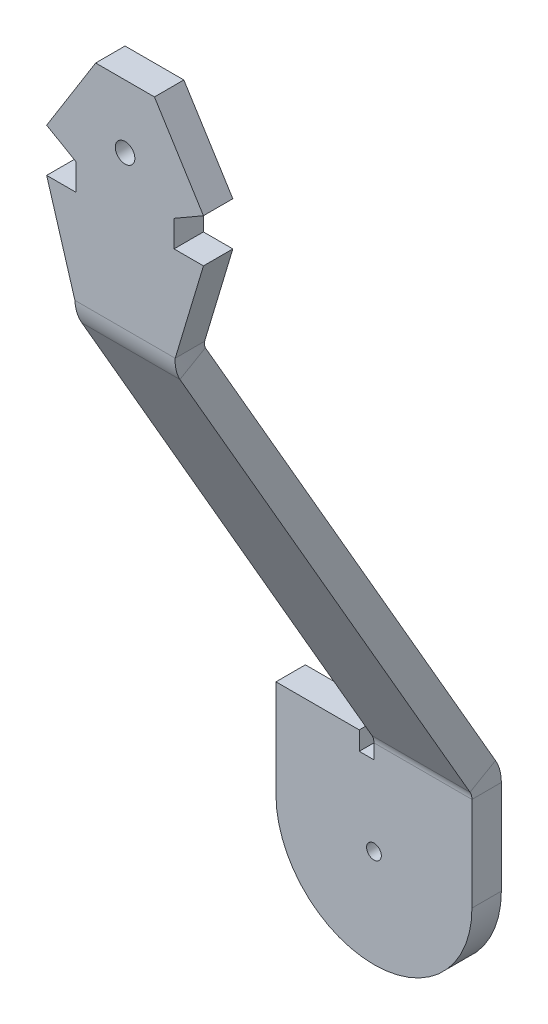
ISO-10303-21;
HEADER;
FILE_DESCRIPTION(('STEP AP214'),'2;1');
FILE_NAME('part.step','',(''),(''),'','','');
FILE_SCHEMA(('AUTOMOTIVE_DESIGN { 1 0 10303 214 1 1 1 1 }'));
ENDSEC;
DATA;
#1=APPLICATION_CONTEXT('core data for automotive mechanical design processes');
#2=APPLICATION_PROTOCOL_DEFINITION('international standard','automotive_design',2000,#1);
#3=PRODUCT_CONTEXT('',#1,'mechanical');
#4=PRODUCT('Part','Part','',(#3));
#5=PRODUCT_RELATED_PRODUCT_CATEGORY('part','',(#4));
#6=PRODUCT_DEFINITION_FORMATION('','',#4);
#7=PRODUCT_DEFINITION_CONTEXT('part definition',#1,'design');
#8=PRODUCT_DEFINITION('design','',#6,#7);
#9=PRODUCT_DEFINITION_SHAPE('','',#8);
#10=(LENGTH_UNIT() NAMED_UNIT(*) SI_UNIT(.MILLI.,.METRE.));
#11=(NAMED_UNIT(*) PLANE_ANGLE_UNIT() SI_UNIT($,.RADIAN.));
#12=(NAMED_UNIT(*) SI_UNIT($,.STERADIAN.) SOLID_ANGLE_UNIT());
#13=UNCERTAINTY_MEASURE_WITH_UNIT(LENGTH_MEASURE(1.E-05),#10,'distance_accuracy_value','');
#14=(GEOMETRIC_REPRESENTATION_CONTEXT(3) GLOBAL_UNCERTAINTY_ASSIGNED_CONTEXT((#13)) GLOBAL_UNIT_ASSIGNED_CONTEXT((#10,
#11,#12)) REPRESENTATION_CONTEXT('',''));
#15=CARTESIAN_POINT('',(0.,0.,0.));
#16=DIRECTION('',(0.,0.,1.));
#17=DIRECTION('',(1.,0.,0.));
#18=AXIS2_PLACEMENT_3D('',#15,#16,#17);
#19=CARTESIAN_POINT('',(0.,31.7307621135332,13.7009618943232));
#20=DIRECTION('',(1.,0.,0.));
#21=DIRECTION('',(0.,1.,0.));
#22=AXIS2_PLACEMENT_3D('',#19,#20,#21);
#23=PLANE('',#22);
#24=DIRECTION('',(0.,-0.499999999999993,0.866025403784442));
#25=VECTOR('',#24,1.);
#26=CARTESIAN_POINT('',(0.,31.559833488678,13.6022762067508));
#27=LINE('',#26,#25);
#28=CARTESIAN_POINT('',(0.,31.559833488678,13.6022762067508));
#29=VERTEX_POINT('',#28);
#30=CARTESIAN_POINT('',(0.,30.809833488678,14.9013143124275));
#31=VERTEX_POINT('',#30);
#32=EDGE_CURVE('E321',#29,#31,#27,.T.);
#33=ORIENTED_EDGE('',*,*,#32,.F.);
#34=DIRECTION('',(0.,0.866025403784442,0.499999999999995));
#35=VECTOR('',#34,1.);
#36=CARTESIAN_POINT('',(0.,31.7307621135332,13.7009618943232));
#37=LINE('',#36,#35);
#38=CARTESIAN_POINT('',(0.,5.92092862485523,-1.20035241810428));
#39=VERTEX_POINT('',#38);
#40=EDGE_CURVE('E547',#39,#29,#37,.T.);
#41=ORIENTED_EDGE('',*,*,#40,.F.);
#42=DIRECTION('',(0.,0.499999999999995,-0.866025403784441));
#43=VECTOR('',#42,1.);
#44=CARTESIAN_POINT('',(0.,5.17092862485523,0.0986856875723804));
#45=LINE('',#44,#43);
#46=CARTESIAN_POINT('',(0.,5.17092862485523,0.0986856875723799));
#47=VERTEX_POINT('',#46);
#48=EDGE_CURVE('E557',#47,#39,#45,.T.);
#49=ORIENTED_EDGE('',*,*,#48,.F.);
#50=DIRECTION('',(0.,0.866025403784442,0.499999999999995));
#51=VECTOR('',#50,1.);
#52=CARTESIAN_POINT('',(0.,30.9807621135332,14.9999999999998));
#53=LINE('',#52,#51);
#54=EDGE_CURVE('E548',#47,#31,#53,.T.);
#55=ORIENTED_EDGE('',*,*,#54,.T.);
#56=EDGE_LOOP('',(#33,#41,#49,#55));
#57=FACE_BOUND('',#56,.T.);
#58=ADVANCED_FACE('F39',(#57),#23,.F.);
#59=CARTESIAN_POINT('',(5.,5.74999999999999,-1.29903810567666));
#60=DIRECTION('',(-1.,0.,0.));
#61=DIRECTION('',(0.,0.,1.));
#62=AXIS2_PLACEMENT_3D('',#59,#60,#61);
#63=PLANE('',#62);
#64=DIRECTION('',(0.,-0.499999999999993,0.866025403784442));
#65=VECTOR('',#64,1.);
#66=CARTESIAN_POINT('',(5.,31.559833488678,13.6022762067508));
#67=LINE('',#66,#65);
#68=CARTESIAN_POINT('',(5.,31.559833488678,13.6022762067508));
#69=VERTEX_POINT('',#68);
#70=CARTESIAN_POINT('',(5.,30.809833488678,14.9013143124275));
#71=VERTEX_POINT('',#70);
#72=EDGE_CURVE('E324',#69,#71,#67,.T.);
#73=ORIENTED_EDGE('',*,*,#72,.T.);
#74=DIRECTION('',(0.,-0.866025403784442,-0.499999999999995));
#75=VECTOR('',#74,1.);
#76=CARTESIAN_POINT('',(5.,5.,0.));
#77=LINE('',#76,#75);
#78=CARTESIAN_POINT('',(5.,5.17092862485523,0.0986856875723803));
#79=VERTEX_POINT('',#78);
#80=EDGE_CURVE('E545',#71,#79,#77,.T.);
#81=ORIENTED_EDGE('',*,*,#80,.T.);
#82=DIRECTION('',(0.,0.499999999999995,-0.866025403784441));
#83=VECTOR('',#82,1.);
#84=CARTESIAN_POINT('',(5.,5.17092862485523,0.0986856875723804));
#85=LINE('',#84,#83);
#86=CARTESIAN_POINT('',(5.,5.92092862485523,-1.20035241810428));
#87=VERTEX_POINT('',#86);
#88=EDGE_CURVE('E323',#79,#87,#85,.T.);
#89=ORIENTED_EDGE('',*,*,#88,.T.);
#90=DIRECTION('',(0.,-0.866025403784442,-0.499999999999995));
#91=VECTOR('',#90,1.);
#92=CARTESIAN_POINT('',(5.,5.74999999999999,-1.29903810567666));
#93=LINE('',#92,#91);
#94=EDGE_CURVE('E480',#69,#87,#93,.T.);
#95=ORIENTED_EDGE('',*,*,#94,.F.);
#96=EDGE_LOOP('',(#73,#81,#89,#95));
#97=FACE_BOUND('',#96,.T.);
#98=ADVANCED_FACE('F377',(#97),#63,.F.);
#99=CARTESIAN_POINT('',(0.,1.99999999999997,-3.46410161513775));
#100=DIRECTION('',(0.,-0.499999999999995,0.866025403784442));
#101=DIRECTION('',(0.,-0.866025403784442,-0.499999999999995));
#102=AXIS2_PLACEMENT_3D('',#99,#100,#101);
#103=PLANE('',#102);
#104=DIRECTION('',(1.,0.,0.));
#105=VECTOR('',#104,1.);
#106=CARTESIAN_POINT('',(5.05921141254343,31.559833488678,13.6022762067508));
#107=LINE('',#106,#105);
#108=EDGE_CURVE('E318',#69,#29,#107,.F.);
#109=ORIENTED_EDGE('',*,*,#108,.F.);
#110=ORIENTED_EDGE('',*,*,#94,.T.);
#111=DIRECTION('',(1.,0.,0.));
#112=VECTOR('',#111,1.);
#113=CARTESIAN_POINT('',(0.,5.92092862485523,-1.20035241810428));
#114=LINE('',#113,#112);
#115=EDGE_CURVE('E551',#39,#87,#114,.T.);
#116=ORIENTED_EDGE('',*,*,#115,.F.);
#117=ORIENTED_EDGE('',*,*,#40,.T.);
#118=EDGE_LOOP('',(#109,#110,#116,#117));
#119=FACE_BOUND('',#118,.T.);
#120=ADVANCED_FACE('F367',(#119),#103,.F.);
#121=CARTESIAN_POINT('',(0.,1.24999999999998,-2.16506350946108));
#122=DIRECTION('',(0.,-0.499999999999995,0.866025403784442));
#123=DIRECTION('',(0.,-0.866025403784442,-0.499999999999995));
#124=AXIS2_PLACEMENT_3D('',#121,#122,#123);
#125=PLANE('',#124);
#126=ORIENTED_EDGE('',*,*,#80,.F.);
#127=DIRECTION('',(1.,0.,0.));
#128=VECTOR('',#127,1.);
#129=CARTESIAN_POINT('',(5.05921141254343,30.809833488678,14.9013143124275));
#130=LINE('',#129,#128);
#131=EDGE_CURVE('E210',#71,#31,#130,.F.);
#132=ORIENTED_EDGE('',*,*,#131,.T.);
#133=ORIENTED_EDGE('',*,*,#54,.F.);
#134=DIRECTION('',(-1.,0.,0.));
#135=VECTOR('',#134,1.);
#136=CARTESIAN_POINT('',(5.,5.17092862485523,0.0986856875723804));
#137=LINE('',#136,#135);
#138=EDGE_CURVE('E360',#79,#47,#137,.T.);
#139=ORIENTED_EDGE('',*,*,#138,.F.);
#140=EDGE_LOOP('',(#126,#132,#133,#139));
#141=FACE_BOUND('',#140,.T.);
#142=ADVANCED_FACE('F376',(#141),#125,.T.);
#143=CARTESIAN_POINT('',(-5.,5.,-1.5));
#144=DIRECTION('',(0.,1.,0.));
#145=DIRECTION('',(0.,0.,1.));
#146=AXIS2_PLACEMENT_3D('',#143,#144,#145);
#147=PLANE('',#146);
#148=DIRECTION('',(-1.,0.,0.));
#149=VECTOR('',#148,1.);
#150=CARTESIAN_POINT('',(-5.,5.,0.));
#151=LINE('',#150,#149);
#152=CARTESIAN_POINT('',(-0.749999999999998,5.,0.));
#153=VERTEX_POINT('',#152);
#154=CARTESIAN_POINT('',(-5.,5.,0.));
#155=VERTEX_POINT('',#154);
#156=EDGE_CURVE('E462',#153,#155,#151,.T.);
#157=ORIENTED_EDGE('',*,*,#156,.F.);
#158=DIRECTION('',(0.,0.,-1.));
#159=VECTOR('',#158,1.);
#160=CARTESIAN_POINT('',(-0.749999999999998,5.,0.));
#161=LINE('',#160,#159);
#162=CARTESIAN_POINT('',(-0.749999999999998,5.00000000000001,-1.5));
#163=VERTEX_POINT('',#162);
#164=EDGE_CURVE('E488',#153,#163,#161,.T.);
#165=ORIENTED_EDGE('',*,*,#164,.T.);
#166=DIRECTION('',(-1.,0.,0.));
#167=VECTOR('',#166,1.);
#168=CARTESIAN_POINT('',(0.,5.,-1.5));
#169=LINE('',#168,#167);
#170=CARTESIAN_POINT('',(-5.,5.,-1.5));
#171=VERTEX_POINT('',#170);
#172=EDGE_CURVE('E520',#163,#171,#169,.T.);
#173=ORIENTED_EDGE('',*,*,#172,.T.);
#174=DIRECTION('',(0.,0.,1.));
#175=VECTOR('',#174,1.);
#176=CARTESIAN_POINT('',(-5.,5.,-1.5));
#177=LINE('',#176,#175);
#178=EDGE_CURVE('E48',#171,#155,#177,.T.);
#179=ORIENTED_EDGE('',*,*,#178,.T.);
#180=EDGE_LOOP('',(#157,#165,#173,#179));
#181=FACE_BOUND('',#180,.T.);
#182=ADVANCED_FACE('F381',(#181),#147,.T.);
#183=CARTESIAN_POINT('',(0.,0.,-1.5));
#184=DIRECTION('',(0.,0.,1.));
#185=DIRECTION('',(1.,0.,0.));
#186=AXIS2_PLACEMENT_3D('',#183,#184,#185);
#187=PLANE('',#186);
#188=CARTESIAN_POINT('',(0.,0.,-1.5));
#189=DIRECTION('',(0.,0.,1.));
#190=DIRECTION('',(1.,0.,0.));
#191=AXIS2_PLACEMENT_3D('',#188,#189,#190);
#192=CIRCLE('',#191,0.375);
#193=CARTESIAN_POINT('',(0.375,0.,-1.5));
#194=VERTEX_POINT('',#193);
#195=EDGE_CURVE('E510',#194,#194,#192,.T.);
#196=ORIENTED_EDGE('',*,*,#195,.T.);
#197=EDGE_LOOP('',(#196));
#198=FACE_BOUND('',#197,.T.);
#199=DIRECTION('',(0.,1.,0.));
#200=VECTOR('',#199,1.);
#201=CARTESIAN_POINT('',(-0.749999999999999,0.,-1.5));
#202=LINE('',#201,#200);
#203=CARTESIAN_POINT('',(-0.749999999999998,4.05262862485525,-1.5));
#204=VERTEX_POINT('',#203);
#205=EDGE_CURVE('E506',#204,#163,#202,.T.);
#206=ORIENTED_EDGE('',*,*,#205,.F.);
#207=DIRECTION('',(-1.,0.,0.));
#208=VECTOR('',#207,1.);
#209=CARTESIAN_POINT('',(0.,4.05262862485525,-1.5));
#210=LINE('',#209,#208);
#211=CARTESIAN_POINT('',(0.,4.05262862485525,-1.5));
#212=VERTEX_POINT('',#211);
#213=EDGE_CURVE('E503',#212,#204,#210,.T.);
#214=ORIENTED_EDGE('',*,*,#213,.F.);
#215=DIRECTION('',(0.,-1.,0.));
#216=VECTOR('',#215,1.);
#217=CARTESIAN_POINT('',(0.,0.,-1.5));
#218=LINE('',#217,#216);
#219=CARTESIAN_POINT('',(0.,4.80262862485524,-1.5));
#220=VERTEX_POINT('',#219);
#221=EDGE_CURVE('E487',#220,#212,#218,.T.);
#222=ORIENTED_EDGE('',*,*,#221,.F.);
#223=DIRECTION('',(-1.,0.,0.));
#224=VECTOR('',#223,1.);
#225=CARTESIAN_POINT('',(0.,4.80262862485524,-1.5));
#226=LINE('',#225,#224);
#227=CARTESIAN_POINT('',(5.,4.80262862485525,-1.5));
#228=VERTEX_POINT('',#227);
#229=EDGE_CURVE('E476',#220,#228,#226,.F.);
#230=ORIENTED_EDGE('',*,*,#229,.T.);
#231=DIRECTION('',(0.,1.,0.));
#232=VECTOR('',#231,1.);
#233=CARTESIAN_POINT('',(5.,5.,-1.5));
#234=LINE('',#233,#232);
#235=CARTESIAN_POINT('',(5.,0.,-1.5));
#236=VERTEX_POINT('',#235);
#237=EDGE_CURVE('E447',#236,#228,#234,.T.);
#238=ORIENTED_EDGE('',*,*,#237,.F.);
#239=CARTESIAN_POINT('',(0.,0.,-1.5));
#240=DIRECTION('',(0.,0.,1.));
#241=DIRECTION('',(1.,0.,0.));
#242=AXIS2_PLACEMENT_3D('',#239,#240,#241);
#243=CIRCLE('',#242,5.);
#244=CARTESIAN_POINT('',(-5.,0.,-1.5));
#245=VERTEX_POINT('',#244);
#246=EDGE_CURVE('E515',#245,#236,#243,.T.);
#247=ORIENTED_EDGE('',*,*,#246,.F.);
#248=DIRECTION('',(0.,-1.,0.));
#249=VECTOR('',#248,1.);
#250=CARTESIAN_POINT('',(-5.,0.,-1.5));
#251=LINE('',#250,#249);
#252=EDGE_CURVE('E523',#171,#245,#251,.T.);
#253=ORIENTED_EDGE('',*,*,#252,.F.);
#254=ORIENTED_EDGE('',*,*,#172,.F.);
#255=EDGE_LOOP('',(#206,#214,#222,#230,#238,#247,#253,#254));
#256=FACE_BOUND('',#255,.T.);
#257=ADVANCED_FACE('F421',(#198,#256),#187,.F.);
#258=CARTESIAN_POINT('',(0.,0.,0.));
#259=DIRECTION('',(0.,0.,1.));
#260=DIRECTION('',(1.,0.,0.));
#261=AXIS2_PLACEMENT_3D('',#258,#259,#260);
#262=PLANE('',#261);
#263=CARTESIAN_POINT('',(0.,0.,0.));
#264=DIRECTION('',(0.,0.,1.));
#265=DIRECTION('',(1.,0.,0.));
#266=AXIS2_PLACEMENT_3D('',#263,#264,#265);
#267=CIRCLE('',#266,0.375);
#268=CARTESIAN_POINT('',(0.375,0.,0.));
#269=VERTEX_POINT('',#268);
#270=EDGE_CURVE('E509',#269,#269,#267,.T.);
#271=ORIENTED_EDGE('',*,*,#270,.F.);
#272=EDGE_LOOP('',(#271));
#273=FACE_BOUND('',#272,.T.);
#274=DIRECTION('',(1.,0.,0.));
#275=VECTOR('',#274,1.);
#276=CARTESIAN_POINT('',(-0.749999999999998,4.05262862485524,0.));
#277=LINE('',#276,#275);
#278=CARTESIAN_POINT('',(-0.749999999999998,4.05262862485524,0.));
#279=VERTEX_POINT('',#278);
#280=CARTESIAN_POINT('',(0.,4.05262862485524,0.));
#281=VERTEX_POINT('',#280);
#282=EDGE_CURVE('E489',#279,#281,#277,.T.);
#283=ORIENTED_EDGE('',*,*,#282,.F.);
#284=DIRECTION('',(0.,-1.,0.));
#285=VECTOR('',#284,1.);
#286=CARTESIAN_POINT('',(-0.749999999999998,5.,0.));
#287=LINE('',#286,#285);
#288=EDGE_CURVE('E484',#153,#279,#287,.T.);
#289=ORIENTED_EDGE('',*,*,#288,.F.);
#290=ORIENTED_EDGE('',*,*,#156,.T.);
#291=DIRECTION('',(0.,-1.,0.));
#292=VECTOR('',#291,1.);
#293=CARTESIAN_POINT('',(-5.,0.,0.));
#294=LINE('',#293,#292);
#295=CARTESIAN_POINT('',(-5.,0.,0.));
#296=VERTEX_POINT('',#295);
#297=EDGE_CURVE('E518',#155,#296,#294,.T.);
#298=ORIENTED_EDGE('',*,*,#297,.T.);
#299=CARTESIAN_POINT('',(0.,0.,0.));
#300=DIRECTION('',(0.,0.,1.));
#301=DIRECTION('',(1.,0.,0.));
#302=AXIS2_PLACEMENT_3D('',#299,#300,#301);
#303=CIRCLE('',#302,5.);
#304=CARTESIAN_POINT('',(5.,0.,0.));
#305=VERTEX_POINT('',#304);
#306=EDGE_CURVE('E461',#296,#305,#303,.T.);
#307=ORIENTED_EDGE('',*,*,#306,.T.);
#308=DIRECTION('',(0.,1.,0.));
#309=VECTOR('',#308,1.);
#310=CARTESIAN_POINT('',(5.,5.,0.));
#311=LINE('',#310,#309);
#312=CARTESIAN_POINT('',(5.,4.80262862485524,0.));
#313=VERTEX_POINT('',#312);
#314=EDGE_CURVE('E444',#305,#313,#311,.T.);
#315=ORIENTED_EDGE('',*,*,#314,.T.);
#316=DIRECTION('',(-1.,0.,0.));
#317=VECTOR('',#316,1.);
#318=CARTESIAN_POINT('',(0.,4.80262862485524,0.));
#319=LINE('',#318,#317);
#320=CARTESIAN_POINT('',(0.,4.80262862485524,0.));
#321=VERTEX_POINT('',#320);
#322=EDGE_CURVE('E457',#321,#313,#319,.F.);
#323=ORIENTED_EDGE('',*,*,#322,.F.);
#324=DIRECTION('',(0.,1.,0.));
#325=VECTOR('',#324,1.);
#326=CARTESIAN_POINT('',(0.,4.05262862485524,0.));
#327=LINE('',#326,#325);
#328=EDGE_CURVE('E64',#281,#321,#327,.T.);
#329=ORIENTED_EDGE('',*,*,#328,.F.);
#330=EDGE_LOOP('',(#283,#289,#290,#298,#307,#315,#323,#329));
#331=FACE_BOUND('',#330,.T.);
#332=ADVANCED_FACE('F424',(#273,#331),#262,.T.);
#333=CARTESIAN_POINT('',(0.,0.,-1.5));
#334=DIRECTION('',(0.,0.,1.));
#335=DIRECTION('',(1.,0.,0.));
#336=AXIS2_PLACEMENT_3D('',#333,#334,#335);
#337=CYLINDRICAL_SURFACE('',#336,5.);
#338=ORIENTED_EDGE('',*,*,#306,.F.);
#339=DIRECTION('',(0.,0.,1.));
#340=VECTOR('',#339,1.);
#341=CARTESIAN_POINT('',(-5.,0.,-1.5));
#342=LINE('',#341,#340);
#343=EDGE_CURVE('E11',#245,#296,#342,.T.);
#344=ORIENTED_EDGE('',*,*,#343,.F.);
#345=ORIENTED_EDGE('',*,*,#246,.T.);
#346=DIRECTION('',(0.,0.,1.));
#347=VECTOR('',#346,1.);
#348=CARTESIAN_POINT('',(5.,0.,-1.5));
#349=LINE('',#348,#347);
#350=EDGE_CURVE('E43',#236,#305,#349,.T.);
#351=ORIENTED_EDGE('',*,*,#350,.T.);
#352=EDGE_LOOP('',(#338,#344,#345,#351));
#353=FACE_BOUND('',#352,.T.);
#354=ADVANCED_FACE('F41',(#353),#337,.T.);
#355=CARTESIAN_POINT('',(-5.,0.,-1.5));
#356=DIRECTION('',(-1.,0.,0.));
#357=DIRECTION('',(0.,0.,1.));
#358=AXIS2_PLACEMENT_3D('',#355,#356,#357);
#359=PLANE('',#358);
#360=ORIENTED_EDGE('',*,*,#297,.F.);
#361=ORIENTED_EDGE('',*,*,#178,.F.);
#362=ORIENTED_EDGE('',*,*,#252,.T.);
#363=ORIENTED_EDGE('',*,*,#343,.T.);
#364=EDGE_LOOP('',(#360,#361,#362,#363));
#365=FACE_BOUND('',#364,.T.);
#366=ADVANCED_FACE('F429',(#365),#359,.T.);
#367=CARTESIAN_POINT('',(5.,5.,-1.5));
#368=DIRECTION('',(1.,0.,0.));
#369=DIRECTION('',(0.,0.,-1.));
#370=AXIS2_PLACEMENT_3D('',#367,#368,#369);
#371=PLANE('',#370);
#372=DIRECTION('',(0.,0.,-1.));
#373=VECTOR('',#372,1.);
#374=CARTESIAN_POINT('',(5.,4.80262862485524,0.));
#375=LINE('',#374,#373);
#376=EDGE_CURVE('E442',#313,#228,#375,.T.);
#377=ORIENTED_EDGE('',*,*,#376,.F.);
#378=ORIENTED_EDGE('',*,*,#314,.F.);
#379=ORIENTED_EDGE('',*,*,#350,.F.);
#380=ORIENTED_EDGE('',*,*,#237,.T.);
#381=EDGE_LOOP('',(#377,#378,#379,#380));
#382=FACE_BOUND('',#381,.T.);
#383=ADVANCED_FACE('F419',(#382),#371,.T.);
#384=CARTESIAN_POINT('',(0.,0.,-1.5));
#385=DIRECTION('',(0.,0.,1.));
#386=DIRECTION('',(1.,0.,0.));
#387=AXIS2_PLACEMENT_3D('',#384,#385,#386);
#388=CYLINDRICAL_SURFACE('',#387,0.375);
#389=ORIENTED_EDGE('',*,*,#195,.F.);
#390=EDGE_LOOP('',(#389));
#391=FACE_BOUND('',#390,.T.);
#392=ORIENTED_EDGE('',*,*,#270,.T.);
#393=EDGE_LOOP('',(#392));
#394=FACE_BOUND('',#393,.T.);
#395=ADVANCED_FACE('F415',(#391,#394),#388,.F.);
#396=CARTESIAN_POINT('',(-0.749999999999998,5.,0.));
#397=DIRECTION('',(1.,0.,0.));
#398=DIRECTION('',(0.,1.,0.));
#399=AXIS2_PLACEMENT_3D('',#396,#397,#398);
#400=PLANE('',#399);
#401=DIRECTION('',(0.,0.,-1.));
#402=VECTOR('',#401,1.);
#403=CARTESIAN_POINT('',(-0.749999999999998,4.05262862485524,0.));
#404=LINE('',#403,#402);
#405=EDGE_CURVE('E492',#279,#204,#404,.T.);
#406=ORIENTED_EDGE('',*,*,#405,.T.);
#407=ORIENTED_EDGE('',*,*,#205,.T.);
#408=ORIENTED_EDGE('',*,*,#164,.F.);
#409=ORIENTED_EDGE('',*,*,#288,.T.);
#410=EDGE_LOOP('',(#406,#407,#408,#409));
#411=FACE_BOUND('',#410,.T.);
#412=ADVANCED_FACE('F411',(#411),#400,.T.);
#413=CARTESIAN_POINT('',(-0.749999999999998,4.05262862485524,0.));
#414=DIRECTION('',(0.,1.,0.));
#415=DIRECTION('',(0.,0.,1.));
#416=AXIS2_PLACEMENT_3D('',#413,#414,#415);
#417=PLANE('',#416);
#418=DIRECTION('',(0.,0.,-1.));
#419=VECTOR('',#418,1.);
#420=CARTESIAN_POINT('',(0.,4.05262862485524,0.));
#421=LINE('',#420,#419);
#422=EDGE_CURVE('E451',#281,#212,#421,.T.);
#423=ORIENTED_EDGE('',*,*,#422,.T.);
#424=ORIENTED_EDGE('',*,*,#213,.T.);
#425=ORIENTED_EDGE('',*,*,#405,.F.);
#426=ORIENTED_EDGE('',*,*,#282,.T.);
#427=EDGE_LOOP('',(#423,#424,#425,#426));
#428=FACE_BOUND('',#427,.T.);
#429=ADVANCED_FACE('F408',(#428),#417,.T.);
#430=CARTESIAN_POINT('',(0.,4.05262862485524,0.));
#431=DIRECTION('',(-1.,0.,0.));
#432=DIRECTION('',(0.,0.,1.));
#433=AXIS2_PLACEMENT_3D('',#430,#431,#432);
#434=PLANE('',#433);
#435=DIRECTION('',(0.,0.,-1.));
#436=VECTOR('',#435,1.);
#437=CARTESIAN_POINT('',(0.,4.80262862485524,0.));
#438=LINE('',#437,#436);
#439=EDGE_CURVE('E452',#321,#220,#438,.T.);
#440=ORIENTED_EDGE('',*,*,#439,.T.);
#441=ORIENTED_EDGE('',*,*,#221,.T.);
#442=ORIENTED_EDGE('',*,*,#422,.F.);
#443=ORIENTED_EDGE('',*,*,#328,.T.);
#444=EDGE_LOOP('',(#440,#441,#442,#443));
#445=FACE_BOUND('',#444,.T.);
#446=ADVANCED_FACE('F401',(#445),#434,.T.);
#447=CARTESIAN_POINT('',(5.,4.80262862485524,0.7366));
#448=DIRECTION('',(1.,0.,0.));
#449=DIRECTION('',(0.,0.,-1.));
#450=AXIS2_PLACEMENT_3D('',#447,#448,#449);
#451=PLANE('',#450);
#452=ORIENTED_EDGE('',*,*,#88,.F.);
#453=CARTESIAN_POINT('',(5.,4.80262862485524,0.7366));
#454=DIRECTION('',(-1.,0.,0.));
#455=DIRECTION('',(0.,0.,1.));
#456=AXIS2_PLACEMENT_3D('',#453,#454,#455);
#457=CIRCLE('',#456,0.7366);
#458=EDGE_CURVE('E466',#313,#79,#457,.F.);
#459=ORIENTED_EDGE('',*,*,#458,.F.);
#460=ORIENTED_EDGE('',*,*,#376,.T.);
#461=CARTESIAN_POINT('',(5.,4.80262862485524,0.7366));
#462=DIRECTION('',(-1.,0.,0.));
#463=DIRECTION('',(0.,0.,1.));
#464=AXIS2_PLACEMENT_3D('',#461,#462,#463);
#465=CIRCLE('',#464,2.2366);
#466=EDGE_CURVE('E483',#228,#87,#465,.F.);
#467=ORIENTED_EDGE('',*,*,#466,.T.);
#468=EDGE_LOOP('',(#452,#459,#460,#467));
#469=FACE_BOUND('',#468,.T.);
#470=ADVANCED_FACE('F398',(#469),#451,.T.);
#471=CARTESIAN_POINT('',(0.,4.80262862485524,0.736599999999999));
#472=DIRECTION('',(1.,0.,0.));
#473=DIRECTION('',(0.,0.,-1.));
#474=AXIS2_PLACEMENT_3D('',#471,#472,#473);
#475=PLANE('',#474);
#476=CARTESIAN_POINT('',(0.,4.80262862485524,0.736599999999999));
#477=DIRECTION('',(-1.,0.,0.));
#478=DIRECTION('',(0.,0.,1.));
#479=AXIS2_PLACEMENT_3D('',#476,#477,#478);
#480=CIRCLE('',#479,0.7366);
#481=EDGE_CURVE('E469',#47,#321,#480,.T.);
#482=ORIENTED_EDGE('',*,*,#481,.F.);
#483=ORIENTED_EDGE('',*,*,#48,.T.);
#484=CARTESIAN_POINT('',(0.,4.80262862485524,0.736599999999999));
#485=DIRECTION('',(-1.,0.,0.));
#486=DIRECTION('',(0.,0.,1.));
#487=AXIS2_PLACEMENT_3D('',#484,#485,#486);
#488=CIRCLE('',#487,2.2366);
#489=EDGE_CURVE('E473',#39,#220,#488,.T.);
#490=ORIENTED_EDGE('',*,*,#489,.T.);
#491=ORIENTED_EDGE('',*,*,#439,.F.);
#492=EDGE_LOOP('',(#482,#483,#490,#491));
#493=FACE_BOUND('',#492,.T.);
#494=ADVANCED_FACE('F393',(#493),#475,.F.);
#495=CARTESIAN_POINT('',(0.,4.80262862485524,0.736599999999999));
#496=DIRECTION('',(-1.,0.,0.));
#497=DIRECTION('',(0.,0.499999999999995,-0.866025403784442));
#498=AXIS2_PLACEMENT_3D('',#495,#496,#497);
#499=CYLINDRICAL_SURFACE('',#498,2.2366);
#500=ORIENTED_EDGE('',*,*,#229,.F.);
#501=ORIENTED_EDGE('',*,*,#489,.F.);
#502=ORIENTED_EDGE('',*,*,#115,.T.);
#503=ORIENTED_EDGE('',*,*,#466,.F.);
#504=EDGE_LOOP('',(#500,#501,#502,#503));
#505=FACE_BOUND('',#504,.T.);
#506=ADVANCED_FACE('F389',(#505),#499,.T.);
#507=CARTESIAN_POINT('',(0.,4.80262862485524,0.736599999999999));
#508=DIRECTION('',(-1.,0.,0.));
#509=DIRECTION('',(0.,0.499999999999995,-0.866025403784442));
#510=AXIS2_PLACEMENT_3D('',#507,#508,#509);
#511=CYLINDRICAL_SURFACE('',#510,0.7366);
#512=ORIENTED_EDGE('',*,*,#322,.T.);
#513=ORIENTED_EDGE('',*,*,#458,.T.);
#514=ORIENTED_EDGE('',*,*,#138,.T.);
#515=ORIENTED_EDGE('',*,*,#481,.T.);
#516=EDGE_LOOP('',(#512,#513,#514,#515));
#517=FACE_BOUND('',#516,.T.);
#518=ADVANCED_FACE('F392',(#517),#511,.F.);
#519=CARTESIAN_POINT('',(0.,30.802333488678,14.9143046934842));
#520=CARTESIAN_POINT('',(-0.0197690358516766,31.143212680798,15.1111113868159));
#521=CARTESIAN_POINT('',(-0.0394423766917431,31.5345201020147,15.2159618943232));
#522=CARTESIAN_POINT('',(-0.0592114125434239,31.928133488678,15.2159618943232));
#523=CARTESIAN_POINT('',(0.,30.809833488678,14.9013143124275));
#524=CARTESIAN_POINT('',(-0.0197690311577286,31.1484417414199,15.0968098782979));
#525=CARTESIAN_POINT('',(-0.0394423813856911,31.5371423569372,15.2009618943232));
#526=CARTESIAN_POINT('',(-0.0592114125434239,31.928133488678,15.2009618943232));
#527=CARTESIAN_POINT('',(0.,31.559833488678,13.6022762067508));
#528=CARTESIAN_POINT('',(-0.0197685617629333,31.6713478036125,13.6666590264967));
#529=CARTESIAN_POINT('',(-0.0394428507804878,31.7993678491862,13.7009618943232));
#530=CARTESIAN_POINT('',(-0.0592114125434239,31.928133488678,13.7009618943232));
#531=B_SPLINE_SURFACE_WITH_KNOTS('',1,3,((#519,#520,#521,#522),(#523,#524,#525,#526),(#527,#528,
#529,#530)),.UNSPECIFIED.,.F.,.F.,.F.,(2,1,2),(4,4),(-0.01,0.,1.),(0.,1.),.UNSPECIFIED.);
#532=DIRECTION('',(0.,0.,1.));
#533=VECTOR('',#532,1.);
#534=CARTESIAN_POINT('',(-0.0592114125434237,31.928133488678,13.7009618943232));
#535=LINE('',#534,#533);
#536=CARTESIAN_POINT('',(-0.0592114125434239,31.928133488678,13.7009618943232));
#537=VERTEX_POINT('',#536);
#538=CARTESIAN_POINT('',(-0.0592114125434239,31.928133488678,15.2009618943232));
#539=VERTEX_POINT('',#538);
#540=EDGE_CURVE('E246',#537,#539,#535,.T.);
#541=CARTESIAN_POINT('',(0.,31.559833488678,13.6022762067508));
#542=CARTESIAN_POINT('',(-0.00477228815250901,31.5867449123141,13.6178248812999));
#543=CARTESIAN_POINT('',(-0.00954369837055761,31.6146466942771,13.6316511374588));
#544=CARTESIAN_POINT('',(-0.0190763654361058,31.6719122845195,13.6556568606504));
#545=CARTESIAN_POINT('',(-0.0238376235942161,31.7012730729912,13.6658435297699));
#546=CARTESIAN_POINT('',(-0.0336546135196544,31.7628944591193,13.6829435927338));
#547=CARTESIAN_POINT('',(-0.0387103728774638,31.7952221625518,13.6896160012103));
#548=CARTESIAN_POINT('',(-0.0489143320705411,31.8610697905943,13.6986723731615));
#549=CARTESIAN_POINT('',(-0.054062547751886,31.8946007037691,13.7009764793903));
#550=CARTESIAN_POINT('',(-0.0592114125434239,31.928133488678,13.7009618943232));
#551=B_SPLINE_CURVE_WITH_KNOTS('',3,(#541,#542,#543,#544,#545,#546,#547,#548,#549,#550),
.UNSPECIFIED.,.F.,.F.,(4,2,2,2,4),(0.,0.0942656836599907,0.188343785703373,0.288231588689756,
0.389928473192413),.UNSPECIFIED.);
#552=EDGE_CURVE('E213',#29,#537,#551,.T.);
#553=CARTESIAN_POINT('',(0.,30.809833488678,14.9013143124275));
#554=CARTESIAN_POINT('',(-0.00255136568093644,30.8535311203424,14.9265460240834));
#555=CARTESIAN_POINT('',(-0.00510283884269758,30.8980840831803,14.9502940551853));
#556=CARTESIAN_POINT('',(-0.0102050021114772,30.9886794908869,14.9947183917003));
#557=CARTESIAN_POINT('',(-0.0127556922244415,31.0347214862475,15.0153956137784));
#558=CARTESIAN_POINT('',(-0.0178568771336025,31.1281012515677,15.0535896216318));
#559=CARTESIAN_POINT('',(-0.0204073719238932,31.1754390515708,15.0711063340582));
#560=CARTESIAN_POINT('',(-0.0255084141547945,31.2711955683813,15.1029036473695));
#561=CARTESIAN_POINT('',(-0.0280589614457286,31.3196145554105,15.1171834290726));
#562=CARTESIAN_POINT('',(-0.0353701866850264,31.4596330675214,15.1533648128979));
#563=CARTESIAN_POINT('',(-0.0401326564517373,31.5523261978845,15.1711624859579));
#564=CARTESIAN_POINT('',(-0.0496678386211379,31.7394006161174,15.1949944450111));
#565=CARTESIAN_POINT('',(-0.0544405523760521,31.8337849218988,15.2010050218467));
#566=CARTESIAN_POINT('',(-0.0592114125434148,31.9281334886778,15.2009618943232));
#567=B_SPLINE_CURVE_WITH_KNOTS('',3,(#553,#554,#555,#556,#557,#558,#559,#560,#561,#562,#563,
#564,#565,#566),.UNSPECIFIED.,.F.,.F.,(4,2,2,2,2,2,4),(0.,0.151539788097901,0.303034248839544,
0.454532225003318,0.606068498616316,0.888792821223438,1.17208524879756),.UNSPECIFIED.);
#568=EDGE_CURVE('E56',#31,#539,#567,.T.);
#569=ORIENTED_EDGE('',*,*,#540,.F.);
#570=ORIENTED_EDGE('',*,*,#552,.F.);
#571=ORIENTED_EDGE('',*,*,#32,.T.);
#572=ORIENTED_EDGE('',*,*,#568,.T.);
#573=EDGE_LOOP('',(#569,#570,#571,#572));
#574=FACE_BOUND('',#573,.T.);
#575=ADVANCED_FACE('F336',(#574),#531,.F.);
#576=CARTESIAN_POINT('',(5.05921141254343,31.928133488678,15.2159618943232));
#577=CARTESIAN_POINT('',(5.03944237669175,31.5345201020147,15.2159618943232));
#578=CARTESIAN_POINT('',(5.01976903585168,31.143212680798,15.1111113868159));
#579=CARTESIAN_POINT('',(5.,30.802333488678,14.9143046934842));
#580=CARTESIAN_POINT('',(5.05921141254343,31.928133488678,15.2009618943232));
#581=CARTESIAN_POINT('',(5.03944238138569,31.5371423569372,15.2009618943232));
#582=CARTESIAN_POINT('',(5.01976903115773,31.14844174142,15.0968098782979));
#583=CARTESIAN_POINT('',(5.,30.809833488678,14.9013143124275));
#584=CARTESIAN_POINT('',(5.05921141254343,31.928133488678,13.7009618943232));
#585=CARTESIAN_POINT('',(5.0394428507805,31.7993678491862,13.7009618943232));
#586=CARTESIAN_POINT('',(5.01976856176293,31.6713478036124,13.6666590264967));
#587=CARTESIAN_POINT('',(5.,31.559833488678,13.6022762067508));
#588=B_SPLINE_SURFACE_WITH_KNOTS('',1,3,((#576,#577,#578,#579),(#580,#581,#582,#583),(#584,#585,
#586,#587)),.UNSPECIFIED.,.F.,.F.,.F.,(2,1,2),(4,4),(-0.01,0.,1.),(0.,1.),.UNSPECIFIED.);
#589=CARTESIAN_POINT('',(5.05921141254343,31.928133488678,13.7009618943232));
#590=CARTESIAN_POINT('',(5.05443912439091,31.8970531748826,13.7009717296598));
#591=CARTESIAN_POINT('',(5.04966771417287,31.8659763948124,13.6989947277512));
#592=CARTESIAN_POINT('',(5.04013504710732,31.8043800773039,13.6911514987501));
#593=CARTESIAN_POINT('',(5.03537378894921,31.7738595540526,13.6852930187517));
#594=CARTESIAN_POINT('',(5.02555679902377,31.7119438367673,13.6692914146207));
#595=CARTESIAN_POINT('',(5.02050103966596,31.6806110201104,13.6589060381495));
#596=CARTESIAN_POINT('',(5.01029708047288,31.6190571154711,13.6338252723042));
#597=CARTESIAN_POINT('',(5.00514886479154,31.5888664397352,13.6190552302439));
#598=CARTESIAN_POINT('',(5.,31.559833488678,13.6022762067508));
#599=B_SPLINE_CURVE_WITH_KNOTS('',3,(#589,#590,#591,#592,#593,#594,#595,#596,#597,#598),
.UNSPECIFIED.,.F.,.F.,(4,2,2,2,4),(0.,0.0942656836599821,0.18834378570335,0.288231588689738,
0.389928473192412),.UNSPECIFIED.);
#600=CARTESIAN_POINT('',(5.05921141254343,31.928133488678,13.7009618943232));
#601=VERTEX_POINT('',#600);
#602=EDGE_CURVE('E221',#601,#69,#599,.T.);
#603=DIRECTION('',(0.,0.,1.));
#604=VECTOR('',#603,1.);
#605=CARTESIAN_POINT('',(5.05921141254343,31.928133488678,13.7009618943232));
#606=LINE('',#605,#604);
#607=CARTESIAN_POINT('',(5.05921141254343,31.928133488678,15.2009618943232));
#608=VERTEX_POINT('',#607);
#609=EDGE_CURVE('E217',#601,#608,#606,.T.);
#610=CARTESIAN_POINT('',(5.05921141254343,31.928133488678,15.2009618943232));
#611=CARTESIAN_POINT('',(5.05666004686249,31.8776743737435,15.200964381766));
#612=CARTESIAN_POINT('',(5.05410857370073,31.827216360561,15.1992542985712));
#613=CARTESIAN_POINT('',(5.04900641043195,31.7265462677634,15.1924291986862));
#614=CARTESIAN_POINT('',(5.04645572031898,31.6763341191011,15.1873152006051));
#615=CARTESIAN_POINT('',(5.04135453540982,31.5763678662077,15.1737022990184));
#616=CARTESIAN_POINT('',(5.03880404061953,31.5266137726326,15.1652033169689));
#617=CARTESIAN_POINT('',(5.03370299838863,31.4277875398411,15.1448623396634));
#618=CARTESIAN_POINT('',(5.0311524510977,31.3787155761968,15.1330194998642));
#619=CARTESIAN_POINT('',(5.0238412258584,31.239365295796,15.0943442413454));
#620=CARTESIAN_POINT('',(5.01907875609169,31.1501918536152,15.0634109131621));
#621=CARTESIAN_POINT('',(5.00954357392229,30.9762646755008,14.9905127860077));
#622=CARTESIAN_POINT('',(5.00477086016737,30.8915201805577,14.9485259453481));
#623=CARTESIAN_POINT('',(5.00000000000001,30.8098334886782,14.9013143124276));
#624=B_SPLINE_CURVE_WITH_KNOTS('',3,(#610,#611,#612,#613,#614,#615,#616,#617,#618,#619,#620,
#621,#622,#623),.UNSPECIFIED.,.F.,.F.,(4,2,2,2,2,2,4),(0.,0.151539788097898,0.303034248839531,
0.454532225003291,0.606068498616276,0.88879282122342,1.17208524879757),.UNSPECIFIED.);
#625=EDGE_CURVE('E204',#608,#71,#624,.T.);
#626=ORIENTED_EDGE('',*,*,#602,.F.);
#627=ORIENTED_EDGE('',*,*,#609,.T.);
#628=ORIENTED_EDGE('',*,*,#625,.T.);
#629=ORIENTED_EDGE('',*,*,#72,.F.);
#630=EDGE_LOOP('',(#626,#627,#628,#629));
#631=FACE_BOUND('',#630,.T.);
#632=ADVANCED_FACE('F219',(#631),#588,.F.);
#633=CARTESIAN_POINT('',(5.05921141254343,31.928133488678,12.9643618943232));
#634=DIRECTION('',(1.,0.,0.));
#635=DIRECTION('',(0.,0.,1.));
#636=AXIS2_PLACEMENT_3D('',#633,#634,#635);
#637=CYLINDRICAL_SURFACE('',#636,2.2366);
#638=ORIENTED_EDGE('',*,*,#131,.F.);
#639=ORIENTED_EDGE('',*,*,#625,.F.);
#640=DIRECTION('',(-1.,0.,0.));
#641=VECTOR('',#640,1.);
#642=CARTESIAN_POINT('',(0.,31.928133488678,15.2009618943232));
#643=LINE('',#642,#641);
#644=EDGE_CURVE('E208',#608,#539,#643,.T.);
#645=ORIENTED_EDGE('',*,*,#644,.T.);
#646=ORIENTED_EDGE('',*,*,#568,.F.);
#647=EDGE_LOOP('',(#638,#639,#645,#646));
#648=FACE_BOUND('',#647,.T.);
#649=ADVANCED_FACE('F206',(#648),#637,.T.);
#650=CARTESIAN_POINT('',(5.05921141254343,31.928133488678,12.9643618943232));
#651=DIRECTION('',(1.,0.,0.));
#652=DIRECTION('',(0.,0.,1.));
#653=AXIS2_PLACEMENT_3D('',#650,#651,#652);
#654=CYLINDRICAL_SURFACE('',#653,0.7366);
#655=ORIENTED_EDGE('',*,*,#108,.T.);
#656=ORIENTED_EDGE('',*,*,#552,.T.);
#657=DIRECTION('',(1.,0.,0.));
#658=VECTOR('',#657,1.);
#659=CARTESIAN_POINT('',(-0.0592114125434237,31.928133488678,13.7009618943232));
#660=LINE('',#659,#658);
#661=EDGE_CURVE('E224',#537,#601,#660,.T.);
#662=ORIENTED_EDGE('',*,*,#661,.T.);
#663=ORIENTED_EDGE('',*,*,#602,.T.);
#664=EDGE_LOOP('',(#655,#656,#662,#663));
#665=FACE_BOUND('',#664,.T.);
#666=ADVANCED_FACE('F344',(#665),#654,.F.);
#667=CARTESIAN_POINT('',(0.,0.,15.2009618943232));
#668=DIRECTION('',(0.,0.,-1.));
#669=DIRECTION('',(-1.,0.,0.));
#670=AXIS2_PLACEMENT_3D('',#667,#668,#669);
#671=PLANE('',#670);
#672=CARTESIAN_POINT('',(2.5,39.7307621135332,15.2009618943232));
#673=DIRECTION('',(0.,0.,1.));
#674=DIRECTION('',(1.,0.,0.));
#675=AXIS2_PLACEMENT_3D('',#672,#673,#674);
#676=CIRCLE('',#675,0.5);
#677=CARTESIAN_POINT('',(3.,39.7307621135332,15.2009618943232));
#678=VERTEX_POINT('',#677);
#679=EDGE_CURVE('E242',#678,#678,#676,.T.);
#680=ORIENTED_EDGE('',*,*,#679,.F.);
#681=EDGE_LOOP('',(#680));
#682=FACE_BOUND('',#681,.T.);
#683=ORIENTED_EDGE('',*,*,#644,.F.);
#684=DIRECTION('',(0.287347885566346,0.957826285221151,0.));
#685=VECTOR('',#684,1.);
#686=CARTESIAN_POINT('',(6.5,36.7307621135332,15.2009618943232));
#687=LINE('',#686,#685);
#688=CARTESIAN_POINT('',(6.5,36.7307621135332,15.2009618943232));
#689=VERTEX_POINT('',#688);
#690=EDGE_CURVE('E227',#608,#689,#687,.T.);
#691=ORIENTED_EDGE('',*,*,#690,.T.);
#692=DIRECTION('',(-1.,0.,0.));
#693=VECTOR('',#692,1.);
#694=CARTESIAN_POINT('',(5.,36.7307621135332,15.2009618943232));
#695=LINE('',#694,#693);
#696=CARTESIAN_POINT('',(5.,36.7307621135332,15.2009618943232));
#697=VERTEX_POINT('',#696);
#698=EDGE_CURVE('E233',#689,#697,#695,.T.);
#699=ORIENTED_EDGE('',*,*,#698,.T.);
#700=DIRECTION('',(0.,1.,0.));
#701=VECTOR('',#700,1.);
#702=CARTESIAN_POINT('',(5.,38.0807621135332,15.2009618943232));
#703=LINE('',#702,#701);
#704=CARTESIAN_POINT('',(5.,38.0807621135332,15.2009618943232));
#705=VERTEX_POINT('',#704);
#706=EDGE_CURVE('E253',#697,#705,#703,.T.);
#707=ORIENTED_EDGE('',*,*,#706,.T.);
#708=DIRECTION('',(0.866025403784441,0.499999999999996,0.));
#709=VECTOR('',#708,1.);
#710=CARTESIAN_POINT('',(6.5,38.9467875173177,15.2009618943232));
#711=LINE('',#710,#709);
#712=CARTESIAN_POINT('',(6.5,38.9467875173177,15.2009618943232));
#713=VERTEX_POINT('',#712);
#714=EDGE_CURVE('E255',#705,#713,#711,.T.);
#715=ORIENTED_EDGE('',*,*,#714,.T.);
#716=DIRECTION('',(-0.52999894000318,0.847998304005088,0.));
#717=VECTOR('',#716,1.);
#718=CARTESIAN_POINT('',(6.5,38.9467875173177,15.2009618943232));
#719=LINE('',#718,#717);
#720=CARTESIAN_POINT('',(4.,42.9467875173177,15.2009618943232));
#721=VERTEX_POINT('',#720);
#722=EDGE_CURVE('E257',#713,#721,#719,.T.);
#723=ORIENTED_EDGE('',*,*,#722,.T.);
#724=DIRECTION('',(-1.,0.,0.));
#725=VECTOR('',#724,1.);
#726=CARTESIAN_POINT('',(4.,42.9467875173177,15.2009618943232));
#727=LINE('',#726,#725);
#728=CARTESIAN_POINT('',(1.,42.9467875173177,15.2009618943232));
#729=VERTEX_POINT('',#728);
#730=EDGE_CURVE('E259',#721,#729,#727,.T.);
#731=ORIENTED_EDGE('',*,*,#730,.T.);
#732=DIRECTION('',(-0.52999894000318,-0.847998304005088,0.));
#733=VECTOR('',#732,1.);
#734=CARTESIAN_POINT('',(1.,42.9467875173177,15.2009618943232));
#735=LINE('',#734,#733);
#736=CARTESIAN_POINT('',(-1.5,38.9467875173177,15.2009618943232));
#737=VERTEX_POINT('',#736);
#738=EDGE_CURVE('E261',#729,#737,#735,.T.);
#739=ORIENTED_EDGE('',*,*,#738,.T.);
#740=DIRECTION('',(0.866025403784441,-0.499999999999996,0.));
#741=VECTOR('',#740,1.);
#742=CARTESIAN_POINT('',(0.,38.0807621135332,15.2009618943232));
#743=LINE('',#742,#741);
#744=CARTESIAN_POINT('',(0.,38.0807621135332,15.2009618943232));
#745=VERTEX_POINT('',#744);
#746=EDGE_CURVE('E263',#737,#745,#743,.T.);
#747=ORIENTED_EDGE('',*,*,#746,.T.);
#748=DIRECTION('',(0.,-1.,0.));
#749=VECTOR('',#748,1.);
#750=CARTESIAN_POINT('',(0.,36.7307621135332,15.2009618943232));
#751=LINE('',#750,#749);
#752=CARTESIAN_POINT('',(0.,36.7307621135332,15.2009618943232));
#753=VERTEX_POINT('',#752);
#754=EDGE_CURVE('E265',#745,#753,#751,.T.);
#755=ORIENTED_EDGE('',*,*,#754,.T.);
#756=DIRECTION('',(-1.,0.,0.));
#757=VECTOR('',#756,1.);
#758=CARTESIAN_POINT('',(0.,36.7307621135332,15.2009618943232));
#759=LINE('',#758,#757);
#760=CARTESIAN_POINT('',(-1.5,36.7307621135332,15.2009618943232));
#761=VERTEX_POINT('',#760);
#762=EDGE_CURVE('E267',#753,#761,#759,.T.);
#763=ORIENTED_EDGE('',*,*,#762,.T.);
#764=DIRECTION('',(0.287347885566346,-0.957826285221151,0.));
#765=VECTOR('',#764,1.);
#766=CARTESIAN_POINT('',(-1.5,36.7307621135332,15.2009618943232));
#767=LINE('',#766,#765);
#768=EDGE_CURVE('E234',#761,#539,#767,.T.);
#769=ORIENTED_EDGE('',*,*,#768,.T.);
#770=EDGE_LOOP('',(#683,#691,#699,#707,#715,#723,#731,#739,#747,#755,#763,#769));
#771=FACE_BOUND('',#770,.T.);
#772=ADVANCED_FACE('F237',(#682,#771),#671,.F.);
#773=CARTESIAN_POINT('',(0.,0.,13.7009618943232));
#774=DIRECTION('',(0.,0.,-1.));
#775=DIRECTION('',(-1.,0.,0.));
#776=AXIS2_PLACEMENT_3D('',#773,#774,#775);
#777=PLANE('',#776);
#778=CARTESIAN_POINT('',(2.5,39.7307621135332,13.7009618943232));
#779=DIRECTION('',(0.,0.,1.));
#780=DIRECTION('',(1.,0.,0.));
#781=AXIS2_PLACEMENT_3D('',#778,#779,#780);
#782=CIRCLE('',#781,0.5);
#783=CARTESIAN_POINT('',(3.,39.7307621135332,13.7009618943232));
#784=VERTEX_POINT('',#783);
#785=EDGE_CURVE('E239',#784,#784,#782,.T.);
#786=ORIENTED_EDGE('',*,*,#785,.T.);
#787=EDGE_LOOP('',(#786));
#788=FACE_BOUND('',#787,.T.);
#789=DIRECTION('',(0.287347885566346,0.957826285221151,0.));
#790=VECTOR('',#789,1.);
#791=CARTESIAN_POINT('',(6.5,36.7307621135332,13.7009618943232));
#792=LINE('',#791,#790);
#793=CARTESIAN_POINT('',(6.5,36.7307621135332,13.7009618943232));
#794=VERTEX_POINT('',#793);
#795=EDGE_CURVE('E272',#601,#794,#792,.T.);
#796=ORIENTED_EDGE('',*,*,#795,.F.);
#797=ORIENTED_EDGE('',*,*,#661,.F.);
#798=DIRECTION('',(0.287347885566346,-0.957826285221151,0.));
#799=VECTOR('',#798,1.);
#800=CARTESIAN_POINT('',(-1.5,36.7307621135332,13.7009618943232));
#801=LINE('',#800,#799);
#802=CARTESIAN_POINT('',(-1.5,36.7307621135332,13.7009618943232));
#803=VERTEX_POINT('',#802);
#804=EDGE_CURVE('E248',#803,#537,#801,.T.);
#805=ORIENTED_EDGE('',*,*,#804,.F.);
#806=DIRECTION('',(-1.,0.,0.));
#807=VECTOR('',#806,1.);
#808=CARTESIAN_POINT('',(0.,36.7307621135332,13.7009618943232));
#809=LINE('',#808,#807);
#810=CARTESIAN_POINT('',(0.,36.7307621135332,13.7009618943232));
#811=VERTEX_POINT('',#810);
#812=EDGE_CURVE('E250',#811,#803,#809,.T.);
#813=ORIENTED_EDGE('',*,*,#812,.F.);
#814=DIRECTION('',(0.,-1.,0.));
#815=VECTOR('',#814,1.);
#816=CARTESIAN_POINT('',(0.,36.7307621135332,13.7009618943232));
#817=LINE('',#816,#815);
#818=CARTESIAN_POINT('',(0.,38.0807621135332,13.7009618943232));
#819=VERTEX_POINT('',#818);
#820=EDGE_CURVE('E288',#819,#811,#817,.T.);
#821=ORIENTED_EDGE('',*,*,#820,.F.);
#822=DIRECTION('',(0.866025403784441,-0.499999999999996,0.));
#823=VECTOR('',#822,1.);
#824=CARTESIAN_POINT('',(0.,38.0807621135332,13.7009618943232));
#825=LINE('',#824,#823);
#826=CARTESIAN_POINT('',(-1.5,38.9467875173177,13.7009618943232));
#827=VERTEX_POINT('',#826);
#828=EDGE_CURVE('E286',#827,#819,#825,.T.);
#829=ORIENTED_EDGE('',*,*,#828,.F.);
#830=DIRECTION('',(-0.52999894000318,-0.847998304005088,0.));
#831=VECTOR('',#830,1.);
#832=CARTESIAN_POINT('',(1.,42.9467875173177,13.7009618943232));
#833=LINE('',#832,#831);
#834=CARTESIAN_POINT('',(1.,42.9467875173177,13.7009618943232));
#835=VERTEX_POINT('',#834);
#836=EDGE_CURVE('E284',#835,#827,#833,.T.);
#837=ORIENTED_EDGE('',*,*,#836,.F.);
#838=DIRECTION('',(-1.,0.,0.));
#839=VECTOR('',#838,1.);
#840=CARTESIAN_POINT('',(4.,42.9467875173177,13.7009618943232));
#841=LINE('',#840,#839);
#842=CARTESIAN_POINT('',(4.,42.9467875173177,13.7009618943232));
#843=VERTEX_POINT('',#842);
#844=EDGE_CURVE('E282',#843,#835,#841,.T.);
#845=ORIENTED_EDGE('',*,*,#844,.F.);
#846=DIRECTION('',(-0.52999894000318,0.847998304005088,0.));
#847=VECTOR('',#846,1.);
#848=CARTESIAN_POINT('',(6.5,38.9467875173177,13.7009618943232));
#849=LINE('',#848,#847);
#850=CARTESIAN_POINT('',(6.5,38.9467875173177,13.7009618943232));
#851=VERTEX_POINT('',#850);
#852=EDGE_CURVE('E280',#851,#843,#849,.T.);
#853=ORIENTED_EDGE('',*,*,#852,.F.);
#854=DIRECTION('',(0.866025403784441,0.499999999999996,0.));
#855=VECTOR('',#854,1.);
#856=CARTESIAN_POINT('',(6.5,38.9467875173177,13.7009618943232));
#857=LINE('',#856,#855);
#858=CARTESIAN_POINT('',(5.,38.0807621135332,13.7009618943232));
#859=VERTEX_POINT('',#858);
#860=EDGE_CURVE('E278',#859,#851,#857,.T.);
#861=ORIENTED_EDGE('',*,*,#860,.F.);
#862=DIRECTION('',(0.,1.,0.));
#863=VECTOR('',#862,1.);
#864=CARTESIAN_POINT('',(5.,38.0807621135332,13.7009618943232));
#865=LINE('',#864,#863);
#866=CARTESIAN_POINT('',(5.,36.7307621135332,13.7009618943232));
#867=VERTEX_POINT('',#866);
#868=EDGE_CURVE('E276',#867,#859,#865,.T.);
#869=ORIENTED_EDGE('',*,*,#868,.F.);
#870=DIRECTION('',(-1.,0.,0.));
#871=VECTOR('',#870,1.);
#872=CARTESIAN_POINT('',(5.,36.7307621135332,13.7009618943232));
#873=LINE('',#872,#871);
#874=EDGE_CURVE('E274',#794,#867,#873,.T.);
#875=ORIENTED_EDGE('',*,*,#874,.F.);
#876=EDGE_LOOP('',(#796,#797,#805,#813,#821,#829,#837,#845,#853,#861,#869,#875));
#877=FACE_BOUND('',#876,.T.);
#878=ADVANCED_FACE('F600',(#788,#877),#777,.T.);
#879=CARTESIAN_POINT('',(-1.5,36.7307621135332,15.2009618943232));
#880=DIRECTION('',(0.957826285221151,0.287347885566346,0.));
#881=DIRECTION('',(-0.287347885566346,0.957826285221151,0.));
#882=AXIS2_PLACEMENT_3D('',#879,#880,#881);
#883=PLANE('',#882);
#884=ORIENTED_EDGE('',*,*,#540,.T.);
#885=ORIENTED_EDGE('',*,*,#768,.F.);
#886=DIRECTION('',(0.,0.,-1.));
#887=VECTOR('',#886,1.);
#888=CARTESIAN_POINT('',(-1.5,36.7307621135332,15.2009618943232));
#889=LINE('',#888,#887);
#890=EDGE_CURVE('E269',#761,#803,#889,.T.);
#891=ORIENTED_EDGE('',*,*,#890,.T.);
#892=ORIENTED_EDGE('',*,*,#804,.T.);
#893=EDGE_LOOP('',(#884,#885,#891,#892));
#894=FACE_BOUND('',#893,.T.);
#895=ADVANCED_FACE('F345',(#894),#883,.F.);
#896=CARTESIAN_POINT('',(6.5,36.7307621135332,15.2009618943232));
#897=DIRECTION('',(-0.957826285221151,0.287347885566346,0.));
#898=DIRECTION('',(-0.287347885566346,-0.957826285221151,0.));
#899=AXIS2_PLACEMENT_3D('',#896,#897,#898);
#900=PLANE('',#899);
#901=ORIENTED_EDGE('',*,*,#609,.F.);
#902=ORIENTED_EDGE('',*,*,#795,.T.);
#903=DIRECTION('',(0.,0.,-1.));
#904=VECTOR('',#903,1.);
#905=CARTESIAN_POINT('',(6.5,36.7307621135332,15.2009618943232));
#906=LINE('',#905,#904);
#907=EDGE_CURVE('E230',#689,#794,#906,.T.);
#908=ORIENTED_EDGE('',*,*,#907,.F.);
#909=ORIENTED_EDGE('',*,*,#690,.F.);
#910=EDGE_LOOP('',(#901,#902,#908,#909));
#911=FACE_BOUND('',#910,.T.);
#912=ADVANCED_FACE('F228',(#911),#900,.F.);
#913=CARTESIAN_POINT('',(5.,36.7307621135332,15.2009618943232));
#914=DIRECTION('',(0.,-1.,0.));
#915=DIRECTION('',(0.,0.,-1.));
#916=AXIS2_PLACEMENT_3D('',#913,#914,#915);
#917=PLANE('',#916);
#918=ORIENTED_EDGE('',*,*,#874,.T.);
#919=DIRECTION('',(0.,0.,-1.));
#920=VECTOR('',#919,1.);
#921=CARTESIAN_POINT('',(5.,36.7307621135332,15.2009618943232));
#922=LINE('',#921,#920);
#923=EDGE_CURVE('E314',#697,#867,#922,.T.);
#924=ORIENTED_EDGE('',*,*,#923,.F.);
#925=ORIENTED_EDGE('',*,*,#698,.F.);
#926=ORIENTED_EDGE('',*,*,#907,.T.);
#927=EDGE_LOOP('',(#918,#924,#925,#926));
#928=FACE_BOUND('',#927,.T.);
#929=ADVANCED_FACE('F620',(#928),#917,.F.);
#930=CARTESIAN_POINT('',(5.,38.0807621135332,15.2009618943232));
#931=DIRECTION('',(-1.,0.,0.));
#932=DIRECTION('',(0.,0.,1.));
#933=AXIS2_PLACEMENT_3D('',#930,#931,#932);
#934=PLANE('',#933);
#935=ORIENTED_EDGE('',*,*,#868,.T.);
#936=DIRECTION('',(0.,0.,-1.));
#937=VECTOR('',#936,1.);
#938=CARTESIAN_POINT('',(5.,38.0807621135332,15.2009618943232));
#939=LINE('',#938,#937);
#940=EDGE_CURVE('E311',#705,#859,#939,.T.);
#941=ORIENTED_EDGE('',*,*,#940,.F.);
#942=ORIENTED_EDGE('',*,*,#706,.F.);
#943=ORIENTED_EDGE('',*,*,#923,.T.);
#944=EDGE_LOOP('',(#935,#941,#942,#943));
#945=FACE_BOUND('',#944,.T.);
#946=ADVANCED_FACE('F626',(#945),#934,.F.);
#947=CARTESIAN_POINT('',(6.5,38.9467875173177,15.2009618943232));
#948=DIRECTION('',(-0.499999999999996,0.866025403784441,0.));
#949=DIRECTION('',(-0.866025403784441,-0.499999999999996,0.));
#950=AXIS2_PLACEMENT_3D('',#947,#948,#949);
#951=PLANE('',#950);
#952=ORIENTED_EDGE('',*,*,#860,.T.);
#953=DIRECTION('',(0.,0.,-1.));
#954=VECTOR('',#953,1.);
#955=CARTESIAN_POINT('',(6.5,38.9467875173177,15.2009618943232));
#956=LINE('',#955,#954);
#957=EDGE_CURVE('E308',#713,#851,#956,.T.);
#958=ORIENTED_EDGE('',*,*,#957,.F.);
#959=ORIENTED_EDGE('',*,*,#714,.F.);
#960=ORIENTED_EDGE('',*,*,#940,.T.);
#961=EDGE_LOOP('',(#952,#958,#959,#960));
#962=FACE_BOUND('',#961,.T.);
#963=ADVANCED_FACE('F634',(#962),#951,.F.);
#964=CARTESIAN_POINT('',(6.5,38.9467875173177,15.2009618943232));
#965=DIRECTION('',(-0.847998304005088,-0.529998940003179,0.));
#966=DIRECTION('',(0.52999894000318,-0.847998304005088,0.));
#967=AXIS2_PLACEMENT_3D('',#964,#965,#966);
#968=PLANE('',#967);
#969=ORIENTED_EDGE('',*,*,#852,.T.);
#970=DIRECTION('',(0.,0.,-1.));
#971=VECTOR('',#970,1.);
#972=CARTESIAN_POINT('',(4.,42.9467875173177,15.2009618943232));
#973=LINE('',#972,#971);
#974=EDGE_CURVE('E305',#721,#843,#973,.T.);
#975=ORIENTED_EDGE('',*,*,#974,.F.);
#976=ORIENTED_EDGE('',*,*,#722,.F.);
#977=ORIENTED_EDGE('',*,*,#957,.T.);
#978=EDGE_LOOP('',(#969,#975,#976,#977));
#979=FACE_BOUND('',#978,.T.);
#980=ADVANCED_FACE('F642',(#979),#968,.F.);
#981=CARTESIAN_POINT('',(4.,42.9467875173177,15.2009618943232));
#982=DIRECTION('',(0.,-1.,0.));
#983=DIRECTION('',(0.,0.,-1.));
#984=AXIS2_PLACEMENT_3D('',#981,#982,#983);
#985=PLANE('',#984);
#986=ORIENTED_EDGE('',*,*,#844,.T.);
#987=DIRECTION('',(0.,0.,-1.));
#988=VECTOR('',#987,1.);
#989=CARTESIAN_POINT('',(1.,42.9467875173177,15.2009618943232));
#990=LINE('',#989,#988);
#991=EDGE_CURVE('E302',#729,#835,#990,.T.);
#992=ORIENTED_EDGE('',*,*,#991,.F.);
#993=ORIENTED_EDGE('',*,*,#730,.F.);
#994=ORIENTED_EDGE('',*,*,#974,.T.);
#995=EDGE_LOOP('',(#986,#992,#993,#994));
#996=FACE_BOUND('',#995,.T.);
#997=ADVANCED_FACE('F650',(#996),#985,.F.);
#998=CARTESIAN_POINT('',(1.,42.9467875173177,15.2009618943232));
#999=DIRECTION('',(0.847998304005088,-0.52999894000318,0.));
#1000=DIRECTION('',(0.52999894000318,0.847998304005088,0.));
#1001=AXIS2_PLACEMENT_3D('',#998,#999,#1000);
#1002=PLANE('',#1001);
#1003=ORIENTED_EDGE('',*,*,#836,.T.);
#1004=DIRECTION('',(0.,0.,-1.));
#1005=VECTOR('',#1004,1.);
#1006=CARTESIAN_POINT('',(-1.5,38.9467875173177,15.2009618943232));
#1007=LINE('',#1006,#1005);
#1008=EDGE_CURVE('E299',#737,#827,#1007,.T.);
#1009=ORIENTED_EDGE('',*,*,#1008,.F.);
#1010=ORIENTED_EDGE('',*,*,#738,.F.);
#1011=ORIENTED_EDGE('',*,*,#991,.T.);
#1012=EDGE_LOOP('',(#1003,#1009,#1010,#1011));
#1013=FACE_BOUND('',#1012,.T.);
#1014=ADVANCED_FACE('F658',(#1013),#1002,.F.);
#1015=CARTESIAN_POINT('',(0.,38.0807621135332,15.2009618943232));
#1016=DIRECTION('',(0.499999999999996,0.866025403784441,0.));
#1017=DIRECTION('',(-0.866025403784441,0.499999999999996,0.));
#1018=AXIS2_PLACEMENT_3D('',#1015,#1016,#1017);
#1019=PLANE('',#1018);
#1020=ORIENTED_EDGE('',*,*,#828,.T.);
#1021=DIRECTION('',(0.,0.,-1.));
#1022=VECTOR('',#1021,1.);
#1023=CARTESIAN_POINT('',(0.,38.0807621135332,15.2009618943232));
#1024=LINE('',#1023,#1022);
#1025=EDGE_CURVE('E296',#745,#819,#1024,.T.);
#1026=ORIENTED_EDGE('',*,*,#1025,.F.);
#1027=ORIENTED_EDGE('',*,*,#746,.F.);
#1028=ORIENTED_EDGE('',*,*,#1008,.T.);
#1029=EDGE_LOOP('',(#1020,#1026,#1027,#1028));
#1030=FACE_BOUND('',#1029,.T.);
#1031=ADVANCED_FACE('F666',(#1030),#1019,.F.);
#1032=CARTESIAN_POINT('',(0.,36.7307621135332,15.2009618943232));
#1033=DIRECTION('',(1.,0.,0.));
#1034=DIRECTION('',(0.,1.,0.));
#1035=AXIS2_PLACEMENT_3D('',#1032,#1033,#1034);
#1036=PLANE('',#1035);
#1037=ORIENTED_EDGE('',*,*,#820,.T.);
#1038=DIRECTION('',(0.,0.,-1.));
#1039=VECTOR('',#1038,1.);
#1040=CARTESIAN_POINT('',(0.,36.7307621135332,15.2009618943232));
#1041=LINE('',#1040,#1039);
#1042=EDGE_CURVE('E293',#753,#811,#1041,.T.);
#1043=ORIENTED_EDGE('',*,*,#1042,.F.);
#1044=ORIENTED_EDGE('',*,*,#754,.F.);
#1045=ORIENTED_EDGE('',*,*,#1025,.T.);
#1046=EDGE_LOOP('',(#1037,#1043,#1044,#1045));
#1047=FACE_BOUND('',#1046,.T.);
#1048=ADVANCED_FACE('F674',(#1047),#1036,.F.);
#1049=CARTESIAN_POINT('',(0.,36.7307621135332,15.2009618943232));
#1050=DIRECTION('',(0.,-1.,0.));
#1051=DIRECTION('',(0.,0.,-1.));
#1052=AXIS2_PLACEMENT_3D('',#1049,#1050,#1051);
#1053=PLANE('',#1052);
#1054=ORIENTED_EDGE('',*,*,#812,.T.);
#1055=ORIENTED_EDGE('',*,*,#890,.F.);
#1056=ORIENTED_EDGE('',*,*,#762,.F.);
#1057=ORIENTED_EDGE('',*,*,#1042,.T.);
#1058=EDGE_LOOP('',(#1054,#1055,#1056,#1057));
#1059=FACE_BOUND('',#1058,.T.);
#1060=ADVANCED_FACE('F682',(#1059),#1053,.F.);
#1061=CARTESIAN_POINT('',(2.5,39.7307621135332,15.2009618943232));
#1062=DIRECTION('',(0.,0.,-1.));
#1063=DIRECTION('',(-1.,0.,0.));
#1064=AXIS2_PLACEMENT_3D('',#1061,#1062,#1063);
#1065=CYLINDRICAL_SURFACE('',#1064,0.5);
#1066=ORIENTED_EDGE('',*,*,#679,.T.);
#1067=EDGE_LOOP('',(#1066));
#1068=FACE_BOUND('',#1067,.T.);
#1069=ORIENTED_EDGE('',*,*,#785,.F.);
#1070=EDGE_LOOP('',(#1069));
#1071=FACE_BOUND('',#1070,.T.);
#1072=ADVANCED_FACE('F690',(#1068,#1071),#1065,.F.);
#1073=CLOSED_SHELL('',(#58,#98,#120,#142,#182,#257,#332,#354,#366,#383,#395,#412,#429,#446,#470,
#494,#506,#518,#575,#632,#649,#666,#772,#878,#895,#912,#929,#946,#963,#980,#997,#1014,#1031,
#1048,#1060,#1072));
#1074=MANIFOLD_SOLID_BREP('B2',#1073);
#1075=ADVANCED_BREP_SHAPE_REPRESENTATION('',(#18,#1074),#14);
#1076=SHAPE_DEFINITION_REPRESENTATION(#9,#1075);
ENDSEC;
END-ISO-10303-21;
